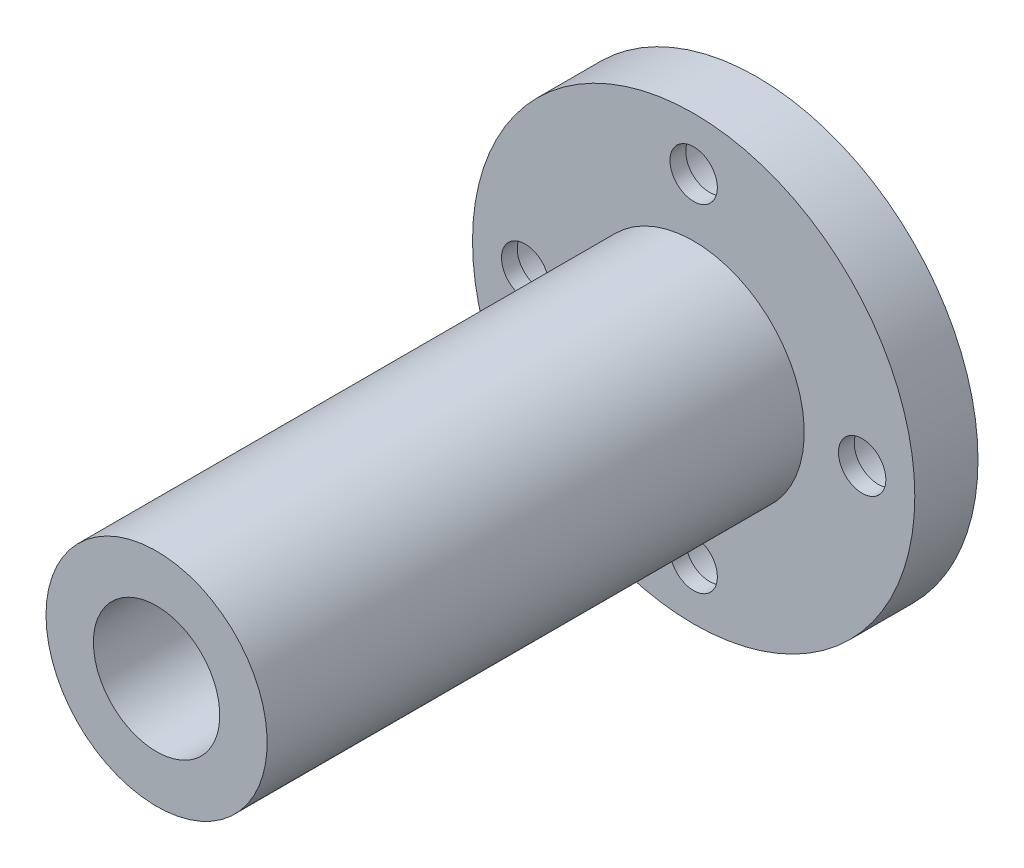
ISO-10303-21;
HEADER;
FILE_DESCRIPTION(('STEP AP214'),'2;1');
FILE_NAME('part.step','',(''),(''),'','','');
FILE_SCHEMA(('AUTOMOTIVE_DESIGN { 1 0 10303 214 1 1 1 1 }'));
ENDSEC;
DATA;
#1=APPLICATION_CONTEXT('core data for automotive mechanical design processes');
#2=APPLICATION_PROTOCOL_DEFINITION('international standard','automotive_design',2000,#1);
#3=PRODUCT_CONTEXT('',#1,'mechanical');
#4=PRODUCT('Part','Part','',(#3));
#5=PRODUCT_RELATED_PRODUCT_CATEGORY('part','',(#4));
#6=PRODUCT_DEFINITION_FORMATION('','',#4);
#7=PRODUCT_DEFINITION_CONTEXT('part definition',#1,'design');
#8=PRODUCT_DEFINITION('design','',#6,#7);
#9=PRODUCT_DEFINITION_SHAPE('','',#8);
#10=(LENGTH_UNIT() NAMED_UNIT(*) SI_UNIT(.MILLI.,.METRE.));
#11=(NAMED_UNIT(*) PLANE_ANGLE_UNIT() SI_UNIT($,.RADIAN.));
#12=(NAMED_UNIT(*) SI_UNIT($,.STERADIAN.) SOLID_ANGLE_UNIT());
#13=UNCERTAINTY_MEASURE_WITH_UNIT(LENGTH_MEASURE(1.E-05),#10,'distance_accuracy_value','');
#14=(GEOMETRIC_REPRESENTATION_CONTEXT(3) GLOBAL_UNCERTAINTY_ASSIGNED_CONTEXT((#13)) GLOBAL_UNIT_ASSIGNED_CONTEXT((#10,
#11,#12)) REPRESENTATION_CONTEXT('',''));
#15=CARTESIAN_POINT('',(0.,0.,0.));
#16=DIRECTION('',(0.,0.,1.));
#17=DIRECTION('',(1.,0.,0.));
#18=AXIS2_PLACEMENT_3D('',#15,#16,#17);
#19=CARTESIAN_POINT('',(16.,0.,0.));
#20=DIRECTION('',(0.,0.,1.));
#21=DIRECTION('',(1.,0.,0.));
#22=AXIS2_PLACEMENT_3D('',#19,#20,#21);
#23=CYLINDRICAL_SURFACE('',#22,2.25);
#24=CARTESIAN_POINT('',(16.,0.,6.));
#25=DIRECTION('',(0.,0.,1.));
#26=DIRECTION('',(1.,0.,0.));
#27=AXIS2_PLACEMENT_3D('',#24,#25,#26);
#28=CIRCLE('',#27,2.25);
#29=CARTESIAN_POINT('',(18.25,0.,6.));
#30=VERTEX_POINT('',#29);
#31=EDGE_CURVE('E86',#30,#30,#28,.T.);
#32=CARTESIAN_POINT('',(16.,0.,4.5));
#33=DIRECTION('',(0.,0.,-1.));
#34=DIRECTION('',(-1.,0.,0.));
#35=AXIS2_PLACEMENT_3D('',#32,#33,#34);
#36=CIRCLE('',#35,2.25);
#37=CARTESIAN_POINT('',(18.25,0.,4.5));
#38=VERTEX_POINT('',#37);
#39=EDGE_CURVE('E34',#38,#38,#36,.F.);
#40=CARTESIAN_POINT('',(18.25,0.,6.));
#41=CARTESIAN_POINT('',(18.25,0.,5.984375));
#42=CARTESIAN_POINT('',(18.25,0.,5.96875));
#43=CARTESIAN_POINT('',(18.25,0.,5.9375));
#44=CARTESIAN_POINT('',(18.25,0.,5.921875));
#45=CARTESIAN_POINT('',(18.25,0.,5.890625));
#46=CARTESIAN_POINT('',(18.25,0.,5.875));
#47=CARTESIAN_POINT('',(18.25,0.,5.84375));
#48=CARTESIAN_POINT('',(18.25,0.,5.828125));
#49=CARTESIAN_POINT('',(18.25,0.,5.796875));
#50=CARTESIAN_POINT('',(18.25,0.,5.78125));
#51=CARTESIAN_POINT('',(18.25,0.,5.75));
#52=CARTESIAN_POINT('',(18.25,0.,5.734375));
#53=CARTESIAN_POINT('',(18.25,0.,5.703125));
#54=CARTESIAN_POINT('',(18.25,0.,5.6875));
#55=CARTESIAN_POINT('',(18.25,0.,5.65625));
#56=CARTESIAN_POINT('',(18.25,0.,5.640625));
#57=CARTESIAN_POINT('',(18.25,0.,5.609375));
#58=CARTESIAN_POINT('',(18.25,0.,5.59375));
#59=CARTESIAN_POINT('',(18.25,0.,5.5625));
#60=CARTESIAN_POINT('',(18.25,0.,5.546875));
#61=CARTESIAN_POINT('',(18.25,0.,5.515625));
#62=CARTESIAN_POINT('',(18.25,0.,5.5));
#63=CARTESIAN_POINT('',(18.25,0.,5.46875));
#64=CARTESIAN_POINT('',(18.25,0.,5.453125));
#65=CARTESIAN_POINT('',(18.25,0.,5.421875));
#66=CARTESIAN_POINT('',(18.25,0.,5.40625));
#67=CARTESIAN_POINT('',(18.25,0.,5.375));
#68=CARTESIAN_POINT('',(18.25,0.,5.359375));
#69=CARTESIAN_POINT('',(18.25,0.,5.328125));
#70=CARTESIAN_POINT('',(18.25,0.,5.3125));
#71=CARTESIAN_POINT('',(18.25,0.,5.28125));
#72=CARTESIAN_POINT('',(18.25,0.,5.265625));
#73=CARTESIAN_POINT('',(18.25,0.,5.234375));
#74=CARTESIAN_POINT('',(18.25,0.,5.21875));
#75=CARTESIAN_POINT('',(18.25,0.,5.1875));
#76=CARTESIAN_POINT('',(18.25,0.,5.171875));
#77=CARTESIAN_POINT('',(18.25,0.,5.140625));
#78=CARTESIAN_POINT('',(18.25,0.,5.125));
#79=CARTESIAN_POINT('',(18.25,0.,5.09375));
#80=CARTESIAN_POINT('',(18.25,0.,5.078125));
#81=CARTESIAN_POINT('',(18.25,0.,5.046875));
#82=CARTESIAN_POINT('',(18.25,0.,5.03125));
#83=CARTESIAN_POINT('',(18.25,0.,5.));
#84=CARTESIAN_POINT('',(18.25,0.,4.984375));
#85=CARTESIAN_POINT('',(18.25,0.,4.953125));
#86=CARTESIAN_POINT('',(18.25,0.,4.9375));
#87=CARTESIAN_POINT('',(18.25,0.,4.90625));
#88=CARTESIAN_POINT('',(18.25,0.,4.890625));
#89=CARTESIAN_POINT('',(18.25,0.,4.859375));
#90=CARTESIAN_POINT('',(18.25,0.,4.84375));
#91=CARTESIAN_POINT('',(18.25,0.,4.8125));
#92=CARTESIAN_POINT('',(18.25,0.,4.796875));
#93=CARTESIAN_POINT('',(18.25,0.,4.765625));
#94=CARTESIAN_POINT('',(18.25,0.,4.75));
#95=CARTESIAN_POINT('',(18.25,0.,4.71875));
#96=CARTESIAN_POINT('',(18.25,0.,4.703125));
#97=CARTESIAN_POINT('',(18.25,0.,4.671875));
#98=CARTESIAN_POINT('',(18.25,0.,4.65625));
#99=CARTESIAN_POINT('',(18.25,0.,4.625));
#100=CARTESIAN_POINT('',(18.25,0.,4.609375));
#101=CARTESIAN_POINT('',(18.25,0.,4.578125));
#102=CARTESIAN_POINT('',(18.25,0.,4.5625));
#103=CARTESIAN_POINT('',(18.25,0.,4.53125));
#104=CARTESIAN_POINT('',(18.25,0.,4.515625));
#105=CARTESIAN_POINT('',(18.25,0.,4.5));
#106=B_SPLINE_CURVE_WITH_KNOTS('',3,(#40,#41,#42,#43,#44,#45,#46,#47,#48,#49,#50,#51,#52,#53,
#54,#55,#56,#57,#58,#59,#60,#61,#62,#63,#64,#65,#66,#67,#68,#69,#70,#71,#72,#73,#74,#75,#76,#77,
#78,#79,#80,#81,#82,#83,#84,#85,#86,#87,#88,#89,#90,#91,#92,#93,#94,#95,#96,#97,#98,#99,#100,
#101,#102,#103,#104,#105),.UNSPECIFIED.,.F.,.F.,(4,2,2,2,2,2,2,2,2,2,2,2,2,2,2,2,2,2,2,2,2,2,2,
2,2,2,2,2,2,2,2,2,4),(0.,0.046875,0.0937500000000001,0.140625,0.1875,0.234375,0.28125,0.328125,
0.375,0.421875,0.46875,0.515625,0.5625,0.609375,0.65625,0.703125,0.75,0.796875,0.84375,0.890625,
0.9375,0.984375,1.03125,1.078125,1.125,1.171875,1.21875,1.265625,1.3125,1.359375,1.40625,
1.453125,1.5),.UNSPECIFIED.);
#107=EDGE_CURVE('BSEAM30',#30,#38,#106,.T.);
#108=ORIENTED_EDGE('',*,*,#31,.T.);
#109=ORIENTED_EDGE('',*,*,#39,.F.);
#110=ORIENTED_EDGE('',*,*,#107,.T.);
#111=ORIENTED_EDGE('',*,*,#107,.F.);
#112=EDGE_LOOP('',(#108,#110,#109,#111));
#113=FACE_BOUND('',#112,.T.);
#114=ADVANCED_FACE('F30',(#113),#23,.F.);
#115=CARTESIAN_POINT('',(0.,-16.,0.));
#116=DIRECTION('',(0.,0.,1.));
#117=DIRECTION('',(1.,0.,0.));
#118=AXIS2_PLACEMENT_3D('',#115,#116,#117);
#119=CYLINDRICAL_SURFACE('',#118,2.25);
#120=CARTESIAN_POINT('',(0.,-16.,6.));
#121=DIRECTION('',(0.,0.,1.));
#122=DIRECTION('',(1.,0.,0.));
#123=AXIS2_PLACEMENT_3D('',#120,#121,#122);
#124=CIRCLE('',#123,2.25);
#125=CARTESIAN_POINT('',(2.25,-16.,6.));
#126=VERTEX_POINT('',#125);
#127=EDGE_CURVE('E83',#126,#126,#124,.T.);
#128=CARTESIAN_POINT('',(0.,-16.,4.5));
#129=DIRECTION('',(0.,0.,-1.));
#130=DIRECTION('',(-1.,0.,0.));
#131=AXIS2_PLACEMENT_3D('',#128,#129,#130);
#132=CIRCLE('',#131,2.25);
#133=CARTESIAN_POINT('',(2.25,-16.,4.5));
#134=VERTEX_POINT('',#133);
#135=EDGE_CURVE('E56',#134,#134,#132,.F.);
#136=CARTESIAN_POINT('',(2.25,-16.,6.));
#137=CARTESIAN_POINT('',(2.25,-16.,5.984375));
#138=CARTESIAN_POINT('',(2.25,-16.,5.96875));
#139=CARTESIAN_POINT('',(2.25,-16.,5.9375));
#140=CARTESIAN_POINT('',(2.25,-16.,5.921875));
#141=CARTESIAN_POINT('',(2.25,-16.,5.890625));
#142=CARTESIAN_POINT('',(2.25,-16.,5.875));
#143=CARTESIAN_POINT('',(2.25,-16.,5.84375));
#144=CARTESIAN_POINT('',(2.25,-16.,5.828125));
#145=CARTESIAN_POINT('',(2.25,-16.,5.796875));
#146=CARTESIAN_POINT('',(2.25,-16.,5.78125));
#147=CARTESIAN_POINT('',(2.25,-16.,5.75));
#148=CARTESIAN_POINT('',(2.25,-16.,5.734375));
#149=CARTESIAN_POINT('',(2.25,-16.,5.703125));
#150=CARTESIAN_POINT('',(2.25,-16.,5.6875));
#151=CARTESIAN_POINT('',(2.25,-16.,5.65625));
#152=CARTESIAN_POINT('',(2.25,-16.,5.640625));
#153=CARTESIAN_POINT('',(2.25,-16.,5.609375));
#154=CARTESIAN_POINT('',(2.25,-16.,5.59375));
#155=CARTESIAN_POINT('',(2.25,-16.,5.5625));
#156=CARTESIAN_POINT('',(2.25,-16.,5.546875));
#157=CARTESIAN_POINT('',(2.25,-16.,5.515625));
#158=CARTESIAN_POINT('',(2.25,-16.,5.5));
#159=CARTESIAN_POINT('',(2.25,-16.,5.46875));
#160=CARTESIAN_POINT('',(2.25,-16.,5.453125));
#161=CARTESIAN_POINT('',(2.25,-16.,5.421875));
#162=CARTESIAN_POINT('',(2.25,-16.,5.40625));
#163=CARTESIAN_POINT('',(2.25,-16.,5.375));
#164=CARTESIAN_POINT('',(2.25,-16.,5.359375));
#165=CARTESIAN_POINT('',(2.25,-16.,5.328125));
#166=CARTESIAN_POINT('',(2.25,-16.,5.3125));
#167=CARTESIAN_POINT('',(2.25,-16.,5.28125));
#168=CARTESIAN_POINT('',(2.25,-16.,5.265625));
#169=CARTESIAN_POINT('',(2.25,-16.,5.234375));
#170=CARTESIAN_POINT('',(2.25,-16.,5.21875));
#171=CARTESIAN_POINT('',(2.25,-16.,5.1875));
#172=CARTESIAN_POINT('',(2.25,-16.,5.171875));
#173=CARTESIAN_POINT('',(2.25,-16.,5.140625));
#174=CARTESIAN_POINT('',(2.25,-16.,5.125));
#175=CARTESIAN_POINT('',(2.25,-16.,5.09375));
#176=CARTESIAN_POINT('',(2.25,-16.,5.078125));
#177=CARTESIAN_POINT('',(2.25,-16.,5.046875));
#178=CARTESIAN_POINT('',(2.25,-16.,5.03125));
#179=CARTESIAN_POINT('',(2.25,-16.,5.));
#180=CARTESIAN_POINT('',(2.25,-16.,4.984375));
#181=CARTESIAN_POINT('',(2.25,-16.,4.953125));
#182=CARTESIAN_POINT('',(2.25,-16.,4.9375));
#183=CARTESIAN_POINT('',(2.25,-16.,4.90625));
#184=CARTESIAN_POINT('',(2.25,-16.,4.890625));
#185=CARTESIAN_POINT('',(2.25,-16.,4.859375));
#186=CARTESIAN_POINT('',(2.25,-16.,4.84375));
#187=CARTESIAN_POINT('',(2.25,-16.,4.8125));
#188=CARTESIAN_POINT('',(2.25,-16.,4.796875));
#189=CARTESIAN_POINT('',(2.25,-16.,4.765625));
#190=CARTESIAN_POINT('',(2.25,-16.,4.75));
#191=CARTESIAN_POINT('',(2.25,-16.,4.71875));
#192=CARTESIAN_POINT('',(2.25,-16.,4.703125));
#193=CARTESIAN_POINT('',(2.25,-16.,4.671875));
#194=CARTESIAN_POINT('',(2.25,-16.,4.65625));
#195=CARTESIAN_POINT('',(2.25,-16.,4.625));
#196=CARTESIAN_POINT('',(2.25,-16.,4.609375));
#197=CARTESIAN_POINT('',(2.25,-16.,4.578125));
#198=CARTESIAN_POINT('',(2.25,-16.,4.5625));
#199=CARTESIAN_POINT('',(2.25,-16.,4.53125));
#200=CARTESIAN_POINT('',(2.25,-16.,4.515625));
#201=CARTESIAN_POINT('',(2.25,-16.,4.5));
#202=B_SPLINE_CURVE_WITH_KNOTS('',3,(#136,#137,#138,#139,#140,#141,#142,#143,#144,#145,#146,
#147,#148,#149,#150,#151,#152,#153,#154,#155,#156,#157,#158,#159,#160,#161,#162,#163,#164,#165,
#166,#167,#168,#169,#170,#171,#172,#173,#174,#175,#176,#177,#178,#179,#180,#181,#182,#183,#184,
#185,#186,#187,#188,#189,#190,#191,#192,#193,#194,#195,#196,#197,#198,#199,#200,#201),
.UNSPECIFIED.,.F.,.F.,(4,2,2,2,2,2,2,2,2,2,2,2,2,2,2,2,2,2,2,2,2,2,2,2,2,2,2,2,2,2,2,2,4),(0.,
0.046875,0.0937500000000001,0.140625,0.1875,0.234375,0.28125,0.328125,0.375,0.421875,0.46875,
0.515625,0.5625,0.609375,0.65625,0.703125,0.75,0.796875,0.84375,0.890625,0.9375,0.984375,
1.03125,1.078125,1.125,1.171875,1.21875,1.265625,1.3125,1.359375,1.40625,1.453125,1.5),.UNSPECIFIED.);
#203=EDGE_CURVE('BSEAM118',#126,#134,#202,.T.);
#204=ORIENTED_EDGE('',*,*,#127,.T.);
#205=ORIENTED_EDGE('',*,*,#135,.F.);
#206=ORIENTED_EDGE('',*,*,#203,.T.);
#207=ORIENTED_EDGE('',*,*,#203,.F.);
#208=EDGE_LOOP('',(#204,#206,#205,#207));
#209=FACE_BOUND('',#208,.T.);
#210=ADVANCED_FACE('F118',(#209),#119,.F.);
#211=CARTESIAN_POINT('',(-16.,0.,0.));
#212=DIRECTION('',(0.,0.,1.));
#213=DIRECTION('',(1.,0.,0.));
#214=AXIS2_PLACEMENT_3D('',#211,#212,#213);
#215=CYLINDRICAL_SURFACE('',#214,2.25);
#216=CARTESIAN_POINT('',(-16.,0.,6.));
#217=DIRECTION('',(0.,0.,1.));
#218=DIRECTION('',(1.,0.,0.));
#219=AXIS2_PLACEMENT_3D('',#216,#217,#218);
#220=CIRCLE('',#219,2.25);
#221=CARTESIAN_POINT('',(-13.75,0.,6.));
#222=VERTEX_POINT('',#221);
#223=EDGE_CURVE('E50',#222,#222,#220,.T.);
#224=CARTESIAN_POINT('',(-16.,0.,4.5));
#225=DIRECTION('',(0.,0.,-1.));
#226=DIRECTION('',(-1.,0.,0.));
#227=AXIS2_PLACEMENT_3D('',#224,#225,#226);
#228=CIRCLE('',#227,2.25);
#229=CARTESIAN_POINT('',(-13.75,0.,4.5));
#230=VERTEX_POINT('',#229);
#231=EDGE_CURVE('E52',#230,#230,#228,.F.);
#232=CARTESIAN_POINT('',(-13.75,0.,6.));
#233=CARTESIAN_POINT('',(-13.75,0.,5.984375));
#234=CARTESIAN_POINT('',(-13.75,0.,5.96875));
#235=CARTESIAN_POINT('',(-13.75,0.,5.9375));
#236=CARTESIAN_POINT('',(-13.75,0.,5.921875));
#237=CARTESIAN_POINT('',(-13.75,0.,5.890625));
#238=CARTESIAN_POINT('',(-13.75,0.,5.875));
#239=CARTESIAN_POINT('',(-13.75,0.,5.84375));
#240=CARTESIAN_POINT('',(-13.75,0.,5.828125));
#241=CARTESIAN_POINT('',(-13.75,0.,5.796875));
#242=CARTESIAN_POINT('',(-13.75,0.,5.78125));
#243=CARTESIAN_POINT('',(-13.75,0.,5.75));
#244=CARTESIAN_POINT('',(-13.75,0.,5.734375));
#245=CARTESIAN_POINT('',(-13.75,0.,5.703125));
#246=CARTESIAN_POINT('',(-13.75,0.,5.6875));
#247=CARTESIAN_POINT('',(-13.75,0.,5.65625));
#248=CARTESIAN_POINT('',(-13.75,0.,5.640625));
#249=CARTESIAN_POINT('',(-13.75,0.,5.609375));
#250=CARTESIAN_POINT('',(-13.75,0.,5.59375));
#251=CARTESIAN_POINT('',(-13.75,0.,5.5625));
#252=CARTESIAN_POINT('',(-13.75,0.,5.546875));
#253=CARTESIAN_POINT('',(-13.75,0.,5.515625));
#254=CARTESIAN_POINT('',(-13.75,0.,5.5));
#255=CARTESIAN_POINT('',(-13.75,0.,5.46875));
#256=CARTESIAN_POINT('',(-13.75,0.,5.453125));
#257=CARTESIAN_POINT('',(-13.75,0.,5.421875));
#258=CARTESIAN_POINT('',(-13.75,0.,5.40625));
#259=CARTESIAN_POINT('',(-13.75,0.,5.375));
#260=CARTESIAN_POINT('',(-13.75,0.,5.359375));
#261=CARTESIAN_POINT('',(-13.75,0.,5.328125));
#262=CARTESIAN_POINT('',(-13.75,0.,5.3125));
#263=CARTESIAN_POINT('',(-13.75,0.,5.28125));
#264=CARTESIAN_POINT('',(-13.75,0.,5.265625));
#265=CARTESIAN_POINT('',(-13.75,0.,5.234375));
#266=CARTESIAN_POINT('',(-13.75,0.,5.21875));
#267=CARTESIAN_POINT('',(-13.75,0.,5.1875));
#268=CARTESIAN_POINT('',(-13.75,0.,5.171875));
#269=CARTESIAN_POINT('',(-13.75,0.,5.140625));
#270=CARTESIAN_POINT('',(-13.75,0.,5.125));
#271=CARTESIAN_POINT('',(-13.75,0.,5.09375));
#272=CARTESIAN_POINT('',(-13.75,0.,5.078125));
#273=CARTESIAN_POINT('',(-13.75,0.,5.046875));
#274=CARTESIAN_POINT('',(-13.75,0.,5.03125));
#275=CARTESIAN_POINT('',(-13.75,0.,5.));
#276=CARTESIAN_POINT('',(-13.75,0.,4.984375));
#277=CARTESIAN_POINT('',(-13.75,0.,4.953125));
#278=CARTESIAN_POINT('',(-13.75,0.,4.9375));
#279=CARTESIAN_POINT('',(-13.75,0.,4.90625));
#280=CARTESIAN_POINT('',(-13.75,0.,4.890625));
#281=CARTESIAN_POINT('',(-13.75,0.,4.859375));
#282=CARTESIAN_POINT('',(-13.75,0.,4.84375));
#283=CARTESIAN_POINT('',(-13.75,0.,4.8125));
#284=CARTESIAN_POINT('',(-13.75,0.,4.796875));
#285=CARTESIAN_POINT('',(-13.75,0.,4.765625));
#286=CARTESIAN_POINT('',(-13.75,0.,4.75));
#287=CARTESIAN_POINT('',(-13.75,0.,4.71875));
#288=CARTESIAN_POINT('',(-13.75,0.,4.703125));
#289=CARTESIAN_POINT('',(-13.75,0.,4.671875));
#290=CARTESIAN_POINT('',(-13.75,0.,4.65625));
#291=CARTESIAN_POINT('',(-13.75,0.,4.625));
#292=CARTESIAN_POINT('',(-13.75,0.,4.609375));
#293=CARTESIAN_POINT('',(-13.75,0.,4.578125));
#294=CARTESIAN_POINT('',(-13.75,0.,4.5625));
#295=CARTESIAN_POINT('',(-13.75,0.,4.53125));
#296=CARTESIAN_POINT('',(-13.75,0.,4.515625));
#297=CARTESIAN_POINT('',(-13.75,0.,4.5));
#298=B_SPLINE_CURVE_WITH_KNOTS('',3,(#232,#233,#234,#235,#236,#237,#238,#239,#240,#241,#242,
#243,#244,#245,#246,#247,#248,#249,#250,#251,#252,#253,#254,#255,#256,#257,#258,#259,#260,#261,
#262,#263,#264,#265,#266,#267,#268,#269,#270,#271,#272,#273,#274,#275,#276,#277,#278,#279,#280,
#281,#282,#283,#284,#285,#286,#287,#288,#289,#290,#291,#292,#293,#294,#295,#296,#297),
.UNSPECIFIED.,.F.,.F.,(4,2,2,2,2,2,2,2,2,2,2,2,2,2,2,2,2,2,2,2,2,2,2,2,2,2,2,2,2,2,2,2,4),(0.,
0.046875,0.0937500000000001,0.140625,0.1875,0.234375,0.28125,0.328125,0.375,0.421875,0.46875,
0.515625,0.5625,0.609375,0.65625,0.703125,0.75,0.796875,0.84375,0.890625,0.9375,0.984375,
1.03125,1.078125,1.125,1.171875,1.21875,1.265625,1.3125,1.359375,1.40625,1.453125,1.5),.UNSPECIFIED.);
#299=EDGE_CURVE('BSEAM124',#222,#230,#298,.T.);
#300=ORIENTED_EDGE('',*,*,#223,.T.);
#301=ORIENTED_EDGE('',*,*,#231,.F.);
#302=ORIENTED_EDGE('',*,*,#299,.T.);
#303=ORIENTED_EDGE('',*,*,#299,.F.);
#304=EDGE_LOOP('',(#300,#302,#301,#303));
#305=FACE_BOUND('',#304,.T.);
#306=ADVANCED_FACE('F124',(#305),#215,.F.);
#307=CARTESIAN_POINT('',(0.,16.,0.));
#308=DIRECTION('',(0.,0.,1.));
#309=DIRECTION('',(1.,0.,0.));
#310=AXIS2_PLACEMENT_3D('',#307,#308,#309);
#311=CYLINDRICAL_SURFACE('',#310,2.25);
#312=CARTESIAN_POINT('',(0.,16.,6.));
#313=DIRECTION('',(0.,0.,1.));
#314=DIRECTION('',(1.,0.,0.));
#315=AXIS2_PLACEMENT_3D('',#312,#313,#314);
#316=CIRCLE('',#315,2.25);
#317=CARTESIAN_POINT('',(2.25,16.,6.));
#318=VERTEX_POINT('',#317);
#319=EDGE_CURVE('E89',#318,#318,#316,.T.);
#320=CARTESIAN_POINT('',(0.,16.,4.5));
#321=DIRECTION('',(0.,0.,-1.));
#322=DIRECTION('',(-1.,0.,0.));
#323=AXIS2_PLACEMENT_3D('',#320,#321,#322);
#324=CIRCLE('',#323,2.25);
#325=CARTESIAN_POINT('',(2.25,16.,4.5));
#326=VERTEX_POINT('',#325);
#327=EDGE_CURVE('E47',#326,#326,#324,.F.);
#328=CARTESIAN_POINT('',(2.25,16.,6.));
#329=CARTESIAN_POINT('',(2.25,16.,5.984375));
#330=CARTESIAN_POINT('',(2.25,16.,5.96875));
#331=CARTESIAN_POINT('',(2.25,16.,5.9375));
#332=CARTESIAN_POINT('',(2.25,16.,5.921875));
#333=CARTESIAN_POINT('',(2.25,16.,5.890625));
#334=CARTESIAN_POINT('',(2.25,16.,5.875));
#335=CARTESIAN_POINT('',(2.25,16.,5.84375));
#336=CARTESIAN_POINT('',(2.25,16.,5.828125));
#337=CARTESIAN_POINT('',(2.25,16.,5.796875));
#338=CARTESIAN_POINT('',(2.25,16.,5.78125));
#339=CARTESIAN_POINT('',(2.25,16.,5.75));
#340=CARTESIAN_POINT('',(2.25,16.,5.734375));
#341=CARTESIAN_POINT('',(2.25,16.,5.703125));
#342=CARTESIAN_POINT('',(2.25,16.,5.6875));
#343=CARTESIAN_POINT('',(2.25,16.,5.65625));
#344=CARTESIAN_POINT('',(2.25,16.,5.640625));
#345=CARTESIAN_POINT('',(2.25,16.,5.609375));
#346=CARTESIAN_POINT('',(2.25,16.,5.59375));
#347=CARTESIAN_POINT('',(2.25,16.,5.5625));
#348=CARTESIAN_POINT('',(2.25,16.,5.546875));
#349=CARTESIAN_POINT('',(2.25,16.,5.515625));
#350=CARTESIAN_POINT('',(2.25,16.,5.5));
#351=CARTESIAN_POINT('',(2.25,16.,5.46875));
#352=CARTESIAN_POINT('',(2.25,16.,5.453125));
#353=CARTESIAN_POINT('',(2.25,16.,5.421875));
#354=CARTESIAN_POINT('',(2.25,16.,5.40625));
#355=CARTESIAN_POINT('',(2.25,16.,5.375));
#356=CARTESIAN_POINT('',(2.25,16.,5.359375));
#357=CARTESIAN_POINT('',(2.25,16.,5.328125));
#358=CARTESIAN_POINT('',(2.25,16.,5.3125));
#359=CARTESIAN_POINT('',(2.25,16.,5.28125));
#360=CARTESIAN_POINT('',(2.25,16.,5.265625));
#361=CARTESIAN_POINT('',(2.25,16.,5.234375));
#362=CARTESIAN_POINT('',(2.25,16.,5.21875));
#363=CARTESIAN_POINT('',(2.25,16.,5.1875));
#364=CARTESIAN_POINT('',(2.25,16.,5.171875));
#365=CARTESIAN_POINT('',(2.25,16.,5.140625));
#366=CARTESIAN_POINT('',(2.25,16.,5.125));
#367=CARTESIAN_POINT('',(2.25,16.,5.09375));
#368=CARTESIAN_POINT('',(2.25,16.,5.078125));
#369=CARTESIAN_POINT('',(2.25,16.,5.046875));
#370=CARTESIAN_POINT('',(2.25,16.,5.03125));
#371=CARTESIAN_POINT('',(2.25,16.,5.));
#372=CARTESIAN_POINT('',(2.25,16.,4.984375));
#373=CARTESIAN_POINT('',(2.25,16.,4.953125));
#374=CARTESIAN_POINT('',(2.25,16.,4.9375));
#375=CARTESIAN_POINT('',(2.25,16.,4.90625));
#376=CARTESIAN_POINT('',(2.25,16.,4.890625));
#377=CARTESIAN_POINT('',(2.25,16.,4.859375));
#378=CARTESIAN_POINT('',(2.25,16.,4.84375));
#379=CARTESIAN_POINT('',(2.25,16.,4.8125));
#380=CARTESIAN_POINT('',(2.25,16.,4.796875));
#381=CARTESIAN_POINT('',(2.25,16.,4.765625));
#382=CARTESIAN_POINT('',(2.25,16.,4.75));
#383=CARTESIAN_POINT('',(2.25,16.,4.71875));
#384=CARTESIAN_POINT('',(2.25,16.,4.703125));
#385=CARTESIAN_POINT('',(2.25,16.,4.671875));
#386=CARTESIAN_POINT('',(2.25,16.,4.65625));
#387=CARTESIAN_POINT('',(2.25,16.,4.625));
#388=CARTESIAN_POINT('',(2.25,16.,4.609375));
#389=CARTESIAN_POINT('',(2.25,16.,4.578125));
#390=CARTESIAN_POINT('',(2.25,16.,4.5625));
#391=CARTESIAN_POINT('',(2.25,16.,4.53125));
#392=CARTESIAN_POINT('',(2.25,16.,4.515625));
#393=CARTESIAN_POINT('',(2.25,16.,4.5));
#394=B_SPLINE_CURVE_WITH_KNOTS('',3,(#328,#329,#330,#331,#332,#333,#334,#335,#336,#337,#338,
#339,#340,#341,#342,#343,#344,#345,#346,#347,#348,#349,#350,#351,#352,#353,#354,#355,#356,#357,
#358,#359,#360,#361,#362,#363,#364,#365,#366,#367,#368,#369,#370,#371,#372,#373,#374,#375,#376,
#377,#378,#379,#380,#381,#382,#383,#384,#385,#386,#387,#388,#389,#390,#391,#392,#393),
.UNSPECIFIED.,.F.,.F.,(4,2,2,2,2,2,2,2,2,2,2,2,2,2,2,2,2,2,2,2,2,2,2,2,2,2,2,2,2,2,2,2,4),(0.,
0.046875,0.0937500000000001,0.140625,0.1875,0.234375,0.28125,0.328125,0.375,0.421875,0.46875,
0.515625,0.5625,0.609375,0.65625,0.703125,0.75,0.796875,0.84375,0.890625,0.9375,0.984375,
1.03125,1.078125,1.125,1.171875,1.21875,1.265625,1.3125,1.359375,1.40625,1.453125,1.5),.UNSPECIFIED.);
#395=EDGE_CURVE('BSEAM130',#318,#326,#394,.T.);
#396=ORIENTED_EDGE('',*,*,#319,.T.);
#397=ORIENTED_EDGE('',*,*,#327,.F.);
#398=ORIENTED_EDGE('',*,*,#395,.T.);
#399=ORIENTED_EDGE('',*,*,#395,.F.);
#400=EDGE_LOOP('',(#396,#398,#397,#399));
#401=FACE_BOUND('',#400,.T.);
#402=ADVANCED_FACE('F130',(#401),#311,.F.);
#403=CARTESIAN_POINT('',(0.,21.,0.));
#404=DIRECTION('',(0.,0.,-1.));
#405=DIRECTION('',(-1.,0.,0.));
#406=AXIS2_PLACEMENT_3D('',#403,#404,#405);
#407=PLANE('',#406);
#408=CARTESIAN_POINT('',(16.,0.,0.));
#409=DIRECTION('',(0.,0.,-1.));
#410=DIRECTION('',(-1.,0.,0.));
#411=AXIS2_PLACEMENT_3D('',#408,#409,#410);
#412=CIRCLE('',#411,3.75);
#413=CARTESIAN_POINT('',(12.25,0.,0.));
#414=VERTEX_POINT('',#413);
#415=EDGE_CURVE('E72',#414,#414,#412,.T.);
#416=ORIENTED_EDGE('',*,*,#415,.F.);
#417=EDGE_LOOP('',(#416));
#418=FACE_BOUND('',#417,.T.);
#419=CARTESIAN_POINT('',(0.,-16.,0.));
#420=DIRECTION('',(0.,0.,-1.));
#421=DIRECTION('',(-1.,0.,0.));
#422=AXIS2_PLACEMENT_3D('',#419,#420,#421);
#423=CIRCLE('',#422,3.75);
#424=CARTESIAN_POINT('',(-3.75,-16.,0.));
#425=VERTEX_POINT('',#424);
#426=EDGE_CURVE('E65',#425,#425,#423,.T.);
#427=ORIENTED_EDGE('',*,*,#426,.F.);
#428=EDGE_LOOP('',(#427));
#429=FACE_BOUND('',#428,.T.);
#430=CARTESIAN_POINT('',(-16.,0.,0.));
#431=DIRECTION('',(0.,0.,-1.));
#432=DIRECTION('',(-1.,0.,0.));
#433=AXIS2_PLACEMENT_3D('',#430,#431,#432);
#434=CIRCLE('',#433,3.75);
#435=CARTESIAN_POINT('',(-19.75,0.,0.));
#436=VERTEX_POINT('',#435);
#437=EDGE_CURVE('E58',#436,#436,#434,.T.);
#438=ORIENTED_EDGE('',*,*,#437,.F.);
#439=EDGE_LOOP('',(#438));
#440=FACE_BOUND('',#439,.T.);
#441=CARTESIAN_POINT('',(0.,16.,0.));
#442=DIRECTION('',(0.,0.,-1.));
#443=DIRECTION('',(-1.,0.,0.));
#444=AXIS2_PLACEMENT_3D('',#441,#442,#443);
#445=CIRCLE('',#444,3.75);
#446=CARTESIAN_POINT('',(-3.75,16.,0.));
#447=VERTEX_POINT('',#446);
#448=EDGE_CURVE('E54',#447,#447,#445,.T.);
#449=ORIENTED_EDGE('',*,*,#448,.F.);
#450=EDGE_LOOP('',(#449));
#451=FACE_BOUND('',#450,.T.);
#452=CARTESIAN_POINT('',(0.,0.,0.));
#453=DIRECTION('',(0.,0.,-1.));
#454=DIRECTION('',(-1.,0.,0.));
#455=AXIS2_PLACEMENT_3D('',#452,#453,#454);
#456=CIRCLE('',#455,21.);
#457=CARTESIAN_POINT('',(-21.,0.,0.));
#458=VERTEX_POINT('',#457);
#459=EDGE_CURVE('E92',#458,#458,#456,.T.);
#460=ORIENTED_EDGE('',*,*,#459,.T.);
#461=EDGE_LOOP('',(#460));
#462=FACE_BOUND('',#461,.T.);
#463=CARTESIAN_POINT('',(0.,0.,0.));
#464=DIRECTION('',(0.,0.,-1.));
#465=DIRECTION('',(-1.,0.,0.));
#466=AXIS2_PLACEMENT_3D('',#463,#464,#465);
#467=CIRCLE('',#466,6.);
#468=CARTESIAN_POINT('',(-6.,0.,0.));
#469=VERTEX_POINT('',#468);
#470=EDGE_CURVE('E10',#469,#469,#467,.T.);
#471=ORIENTED_EDGE('',*,*,#470,.F.);
#472=EDGE_LOOP('',(#471));
#473=FACE_BOUND('',#472,.T.);
#474=ADVANCED_FACE('F32',(#418,#429,#440,#451,#462,#473),#407,.T.);
#475=CARTESIAN_POINT('',(0.,0.,0.));
#476=DIRECTION('',(0.,0.,-1.));
#477=DIRECTION('',(-1.,0.,0.));
#478=AXIS2_PLACEMENT_3D('',#475,#476,#477);
#479=CYLINDRICAL_SURFACE('',#478,6.);
#480=ORIENTED_EDGE('',*,*,#470,.T.);
#481=EDGE_LOOP('',(#480));
#482=FACE_BOUND('',#481,.T.);
#483=CARTESIAN_POINT('',(0.,0.,57.));
#484=DIRECTION('',(0.,0.,-1.));
#485=DIRECTION('',(-1.,0.,0.));
#486=AXIS2_PLACEMENT_3D('',#483,#484,#485);
#487=CIRCLE('',#486,5.99999999999999);
#488=CARTESIAN_POINT('',(-5.99999999999999,0.,57.));
#489=VERTEX_POINT('',#488);
#490=EDGE_CURVE('E38',#489,#489,#487,.T.);
#491=ORIENTED_EDGE('',*,*,#490,.F.);
#492=EDGE_LOOP('',(#491));
#493=FACE_BOUND('',#492,.T.);
#494=ADVANCED_FACE('F108',(#482,#493),#479,.F.);
#495=CARTESIAN_POINT('',(0.,5.99999999999999,57.));
#496=DIRECTION('',(0.,0.,1.));
#497=DIRECTION('',(1.,0.,0.));
#498=AXIS2_PLACEMENT_3D('',#495,#496,#497);
#499=PLANE('',#498);
#500=ORIENTED_EDGE('',*,*,#490,.T.);
#501=EDGE_LOOP('',(#500));
#502=FACE_BOUND('',#501,.T.);
#503=CARTESIAN_POINT('',(0.,0.,57.));
#504=DIRECTION('',(0.,0.,-1.));
#505=DIRECTION('',(-1.,0.,0.));
#506=AXIS2_PLACEMENT_3D('',#503,#504,#505);
#507=CIRCLE('',#506,10.5);
#508=CARTESIAN_POINT('',(-10.5,0.,57.));
#509=VERTEX_POINT('',#508);
#510=EDGE_CURVE('E43',#509,#509,#507,.T.);
#511=ORIENTED_EDGE('',*,*,#510,.F.);
#512=EDGE_LOOP('',(#511));
#513=FACE_BOUND('',#512,.T.);
#514=ADVANCED_FACE('F106',(#502,#513),#499,.T.);
#515=CARTESIAN_POINT('',(0.,0.,0.));
#516=DIRECTION('',(0.,0.,-1.));
#517=DIRECTION('',(-1.,0.,0.));
#518=AXIS2_PLACEMENT_3D('',#515,#516,#517);
#519=CYLINDRICAL_SURFACE('',#518,10.5);
#520=ORIENTED_EDGE('',*,*,#510,.T.);
#521=EDGE_LOOP('',(#520));
#522=FACE_BOUND('',#521,.T.);
#523=CARTESIAN_POINT('',(0.,0.,6.));
#524=DIRECTION('',(0.,0.,-1.));
#525=DIRECTION('',(-1.,0.,0.));
#526=AXIS2_PLACEMENT_3D('',#523,#524,#525);
#527=CIRCLE('',#526,10.5);
#528=CARTESIAN_POINT('',(-10.5,0.,6.));
#529=VERTEX_POINT('',#528);
#530=EDGE_CURVE('E98',#529,#529,#527,.T.);
#531=ORIENTED_EDGE('',*,*,#530,.F.);
#532=EDGE_LOOP('',(#531));
#533=FACE_BOUND('',#532,.T.);
#534=ADVANCED_FACE('F103',(#522,#533),#519,.T.);
#535=CARTESIAN_POINT('',(0.,10.5,6.));
#536=DIRECTION('',(0.,0.,1.));
#537=DIRECTION('',(1.,0.,0.));
#538=AXIS2_PLACEMENT_3D('',#535,#536,#537);
#539=PLANE('',#538);
#540=ORIENTED_EDGE('',*,*,#223,.F.);
#541=EDGE_LOOP('',(#540));
#542=FACE_BOUND('',#541,.T.);
#543=ORIENTED_EDGE('',*,*,#127,.F.);
#544=EDGE_LOOP('',(#543));
#545=FACE_BOUND('',#544,.T.);
#546=ORIENTED_EDGE('',*,*,#31,.F.);
#547=EDGE_LOOP('',(#546));
#548=FACE_BOUND('',#547,.T.);
#549=ORIENTED_EDGE('',*,*,#319,.F.);
#550=EDGE_LOOP('',(#549));
#551=FACE_BOUND('',#550,.T.);
#552=ORIENTED_EDGE('',*,*,#530,.T.);
#553=EDGE_LOOP('',(#552));
#554=FACE_BOUND('',#553,.T.);
#555=CARTESIAN_POINT('',(0.,0.,6.));
#556=DIRECTION('',(0.,0.,-1.));
#557=DIRECTION('',(-1.,0.,0.));
#558=AXIS2_PLACEMENT_3D('',#555,#556,#557);
#559=CIRCLE('',#558,21.);
#560=CARTESIAN_POINT('',(-21.,0.,6.));
#561=VERTEX_POINT('',#560);
#562=EDGE_CURVE('E95',#561,#561,#559,.T.);
#563=ORIENTED_EDGE('',*,*,#562,.F.);
#564=EDGE_LOOP('',(#563));
#565=FACE_BOUND('',#564,.T.);
#566=ADVANCED_FACE('F115',(#542,#545,#548,#551,#554,#565),#539,.T.);
#567=CARTESIAN_POINT('',(0.,0.,0.));
#568=DIRECTION('',(0.,0.,-1.));
#569=DIRECTION('',(-1.,0.,0.));
#570=AXIS2_PLACEMENT_3D('',#567,#568,#569);
#571=CYLINDRICAL_SURFACE('',#570,21.);
#572=ORIENTED_EDGE('',*,*,#562,.T.);
#573=EDGE_LOOP('',(#572));
#574=FACE_BOUND('',#573,.T.);
#575=ORIENTED_EDGE('',*,*,#459,.F.);
#576=EDGE_LOOP('',(#575));
#577=FACE_BOUND('',#576,.T.);
#578=ADVANCED_FACE('F134',(#574,#577),#571,.T.);
#579=CARTESIAN_POINT('',(0.,16.,4.5));
#580=DIRECTION('',(0.,0.,-1.));
#581=DIRECTION('',(-1.,0.,0.));
#582=AXIS2_PLACEMENT_3D('',#579,#580,#581);
#583=PLANE('',#582);
#584=CARTESIAN_POINT('',(0.,16.,4.5));
#585=DIRECTION('',(0.,0.,-1.));
#586=DIRECTION('',(-1.,0.,0.));
#587=AXIS2_PLACEMENT_3D('',#584,#585,#586);
#588=CIRCLE('',#587,3.75);
#589=CARTESIAN_POINT('',(-3.75,16.,4.5));
#590=VERTEX_POINT('',#589);
#591=EDGE_CURVE('E51',#590,#590,#588,.T.);
#592=ORIENTED_EDGE('',*,*,#591,.T.);
#593=EDGE_LOOP('',(#592));
#594=FACE_BOUND('',#593,.T.);
#595=ORIENTED_EDGE('',*,*,#327,.T.);
#596=EDGE_LOOP('',(#595));
#597=FACE_BOUND('',#596,.T.);
#598=ADVANCED_FACE('F137',(#594,#597),#583,.T.);
#599=CARTESIAN_POINT('',(0.,16.,4.5));
#600=DIRECTION('',(0.,0.,-1.));
#601=DIRECTION('',(-1.,0.,0.));
#602=AXIS2_PLACEMENT_3D('',#599,#600,#601);
#603=CYLINDRICAL_SURFACE('',#602,3.75);
#604=ORIENTED_EDGE('',*,*,#591,.F.);
#605=EDGE_LOOP('',(#604));
#606=FACE_BOUND('',#605,.T.);
#607=ORIENTED_EDGE('',*,*,#448,.T.);
#608=EDGE_LOOP('',(#607));
#609=FACE_BOUND('',#608,.T.);
#610=ADVANCED_FACE('F171',(#606,#609),#603,.F.);
#611=CARTESIAN_POINT('',(-16.,0.,4.5));
#612=DIRECTION('',(0.,0.,-1.));
#613=DIRECTION('',(-1.,0.,0.));
#614=AXIS2_PLACEMENT_3D('',#611,#612,#613);
#615=PLANE('',#614);
#616=CARTESIAN_POINT('',(-16.,0.,4.5));
#617=DIRECTION('',(0.,0.,-1.));
#618=DIRECTION('',(-1.,0.,0.));
#619=AXIS2_PLACEMENT_3D('',#616,#617,#618);
#620=CIRCLE('',#619,3.75);
#621=CARTESIAN_POINT('',(-19.75,0.,4.5));
#622=VERTEX_POINT('',#621);
#623=EDGE_CURVE('E55',#622,#622,#620,.T.);
#624=ORIENTED_EDGE('',*,*,#623,.T.);
#625=EDGE_LOOP('',(#624));
#626=FACE_BOUND('',#625,.T.);
#627=ORIENTED_EDGE('',*,*,#231,.T.);
#628=EDGE_LOOP('',(#627));
#629=FACE_BOUND('',#628,.T.);
#630=ADVANCED_FACE('F173',(#626,#629),#615,.T.);
#631=CARTESIAN_POINT('',(-16.,0.,4.5));
#632=DIRECTION('',(0.,0.,-1.));
#633=DIRECTION('',(-1.,0.,0.));
#634=AXIS2_PLACEMENT_3D('',#631,#632,#633);
#635=CYLINDRICAL_SURFACE('',#634,3.75);
#636=ORIENTED_EDGE('',*,*,#623,.F.);
#637=EDGE_LOOP('',(#636));
#638=FACE_BOUND('',#637,.T.);
#639=ORIENTED_EDGE('',*,*,#437,.T.);
#640=EDGE_LOOP('',(#639));
#641=FACE_BOUND('',#640,.T.);
#642=ADVANCED_FACE('F180',(#638,#641),#635,.F.);
#643=CARTESIAN_POINT('',(0.,-16.,4.5));
#644=DIRECTION('',(0.,0.,-1.));
#645=DIRECTION('',(-1.,0.,0.));
#646=AXIS2_PLACEMENT_3D('',#643,#644,#645);
#647=PLANE('',#646);
#648=CARTESIAN_POINT('',(0.,-16.,4.5));
#649=DIRECTION('',(0.,0.,-1.));
#650=DIRECTION('',(-1.,0.,0.));
#651=AXIS2_PLACEMENT_3D('',#648,#649,#650);
#652=CIRCLE('',#651,3.75);
#653=CARTESIAN_POINT('',(-3.75,-16.,4.5));
#654=VERTEX_POINT('',#653);
#655=EDGE_CURVE('E59',#654,#654,#652,.T.);
#656=ORIENTED_EDGE('',*,*,#655,.T.);
#657=EDGE_LOOP('',(#656));
#658=FACE_BOUND('',#657,.T.);
#659=ORIENTED_EDGE('',*,*,#135,.T.);
#660=EDGE_LOOP('',(#659));
#661=FACE_BOUND('',#660,.T.);
#662=ADVANCED_FACE('F232',(#658,#661),#647,.T.);
#663=CARTESIAN_POINT('',(0.,-16.,4.5));
#664=DIRECTION('',(0.,0.,-1.));
#665=DIRECTION('',(-1.,0.,0.));
#666=AXIS2_PLACEMENT_3D('',#663,#664,#665);
#667=CYLINDRICAL_SURFACE('',#666,3.75);
#668=ORIENTED_EDGE('',*,*,#655,.F.);
#669=EDGE_LOOP('',(#668));
#670=FACE_BOUND('',#669,.T.);
#671=ORIENTED_EDGE('',*,*,#426,.T.);
#672=EDGE_LOOP('',(#671));
#673=FACE_BOUND('',#672,.T.);
#674=ADVANCED_FACE('F241',(#670,#673),#667,.F.);
#675=CARTESIAN_POINT('',(16.,0.,4.5));
#676=DIRECTION('',(0.,0.,-1.));
#677=DIRECTION('',(-1.,0.,0.));
#678=AXIS2_PLACEMENT_3D('',#675,#676,#677);
#679=PLANE('',#678);
#680=CARTESIAN_POINT('',(16.,0.,4.5));
#681=DIRECTION('',(0.,0.,-1.));
#682=DIRECTION('',(-1.,0.,0.));
#683=AXIS2_PLACEMENT_3D('',#680,#681,#682);
#684=CIRCLE('',#683,3.75);
#685=CARTESIAN_POINT('',(12.25,0.,4.5));
#686=VERTEX_POINT('',#685);
#687=EDGE_CURVE('E277',#686,#686,#684,.T.);
#688=ORIENTED_EDGE('',*,*,#687,.T.);
#689=EDGE_LOOP('',(#688));
#690=FACE_BOUND('',#689,.T.);
#691=ORIENTED_EDGE('',*,*,#39,.T.);
#692=EDGE_LOOP('',(#691));
#693=FACE_BOUND('',#692,.T.);
#694=ADVANCED_FACE('F250',(#690,#693),#679,.T.);
#695=CARTESIAN_POINT('',(16.,0.,4.5));
#696=DIRECTION('',(0.,0.,-1.));
#697=DIRECTION('',(-1.,0.,0.));
#698=AXIS2_PLACEMENT_3D('',#695,#696,#697);
#699=CYLINDRICAL_SURFACE('',#698,3.75);
#700=ORIENTED_EDGE('',*,*,#687,.F.);
#701=EDGE_LOOP('',(#700));
#702=FACE_BOUND('',#701,.T.);
#703=ORIENTED_EDGE('',*,*,#415,.T.);
#704=EDGE_LOOP('',(#703));
#705=FACE_BOUND('',#704,.T.);
#706=ADVANCED_FACE('F260',(#702,#705),#699,.F.);
#707=CLOSED_SHELL('',(#114,#210,#306,#402,#474,#494,#514,#534,#566,#578,#598,#610,#630,#642,
#662,#674,#694,#706));
#708=MANIFOLD_SOLID_BREP('B2',#707);
#709=ADVANCED_BREP_SHAPE_REPRESENTATION('',(#18,#708),#14);
#710=SHAPE_DEFINITION_REPRESENTATION(#9,#709);
ENDSEC;
END-ISO-10303-21;
